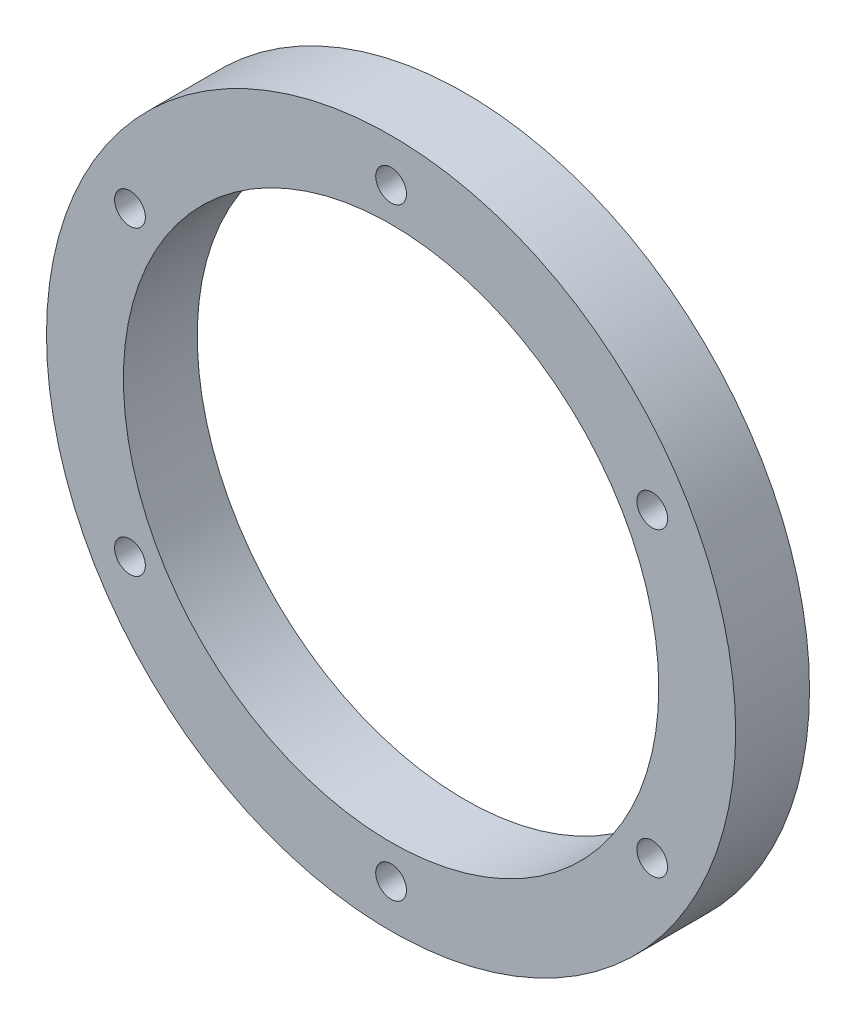
ISO-10303-21;
HEADER;
FILE_DESCRIPTION(('STEP AP214'),'2;1');
FILE_NAME('part.step','',(''),(''),'','','');
FILE_SCHEMA(('AUTOMOTIVE_DESIGN { 1 0 10303 214 1 1 1 1 }'));
ENDSEC;
DATA;
#1=APPLICATION_CONTEXT('core data for automotive mechanical design processes');
#2=APPLICATION_PROTOCOL_DEFINITION('international standard','automotive_design',2000,#1);
#3=PRODUCT_CONTEXT('',#1,'mechanical');
#4=PRODUCT('Part','Part','',(#3));
#5=PRODUCT_RELATED_PRODUCT_CATEGORY('part','',(#4));
#6=PRODUCT_DEFINITION_FORMATION('','',#4);
#7=PRODUCT_DEFINITION_CONTEXT('part definition',#1,'design');
#8=PRODUCT_DEFINITION('design','',#6,#7);
#9=PRODUCT_DEFINITION_SHAPE('','',#8);
#10=(LENGTH_UNIT() NAMED_UNIT(*) SI_UNIT(.MILLI.,.METRE.));
#11=(NAMED_UNIT(*) PLANE_ANGLE_UNIT() SI_UNIT($,.RADIAN.));
#12=(NAMED_UNIT(*) SI_UNIT($,.STERADIAN.) SOLID_ANGLE_UNIT());
#13=UNCERTAINTY_MEASURE_WITH_UNIT(LENGTH_MEASURE(1.E-05),#10,'distance_accuracy_value','');
#14=(GEOMETRIC_REPRESENTATION_CONTEXT(3) GLOBAL_UNCERTAINTY_ASSIGNED_CONTEXT((#13)) GLOBAL_UNIT_ASSIGNED_CONTEXT((#10,
#11,#12)) REPRESENTATION_CONTEXT('',''));
#15=CARTESIAN_POINT('',(0.,0.,0.));
#16=DIRECTION('',(0.,0.,1.));
#17=DIRECTION('',(1.,0.,0.));
#18=AXIS2_PLACEMENT_3D('',#15,#16,#17);
#19=CARTESIAN_POINT('',(0.,0.,6.));
#20=DIRECTION('',(0.,0.,1.));
#21=DIRECTION('',(1.,0.,0.));
#22=AXIS2_PLACEMENT_3D('',#19,#20,#21);
#23=PLANE('',#22);
#24=CARTESIAN_POINT('',(-21.2176223927187,-12.25,6.));
#25=DIRECTION('',(0.,0.,1.));
#26=DIRECTION('',(1.,0.,0.));
#27=AXIS2_PLACEMENT_3D('',#24,#25,#26);
#28=CIRCLE('',#27,1.25);
#29=CARTESIAN_POINT('',(-19.9676223927187,-12.25,6.));
#30=VERTEX_POINT('',#29);
#31=EDGE_CURVE('E73',#30,#30,#28,.T.);
#32=ORIENTED_EDGE('',*,*,#31,.F.);
#33=EDGE_LOOP('',(#32));
#34=FACE_BOUND('',#33,.T.);
#35=CARTESIAN_POINT('',(21.2176223927188,-12.25,6.));
#36=DIRECTION('',(0.,0.,1.));
#37=DIRECTION('',(1.,0.,0.));
#38=AXIS2_PLACEMENT_3D('',#35,#36,#37);
#39=CIRCLE('',#38,1.25);
#40=CARTESIAN_POINT('',(22.4676223927188,-12.25,6.));
#41=VERTEX_POINT('',#40);
#42=EDGE_CURVE('E61',#41,#41,#39,.T.);
#43=ORIENTED_EDGE('',*,*,#42,.F.);
#44=EDGE_LOOP('',(#43));
#45=FACE_BOUND('',#44,.T.);
#46=CARTESIAN_POINT('',(0.,0.,6.));
#47=DIRECTION('',(0.,0.,1.));
#48=DIRECTION('',(1.,0.,0.));
#49=AXIS2_PLACEMENT_3D('',#46,#47,#48);
#50=CIRCLE('',#49,21.75);
#51=CARTESIAN_POINT('',(21.75,0.,6.));
#52=VERTEX_POINT('',#51);
#53=EDGE_CURVE('E49',#52,#52,#50,.T.);
#54=ORIENTED_EDGE('',*,*,#53,.F.);
#55=EDGE_LOOP('',(#54));
#56=FACE_BOUND('',#55,.T.);
#57=CARTESIAN_POINT('',(0.,0.,6.));
#58=DIRECTION('',(0.,0.,1.));
#59=DIRECTION('',(1.,0.,0.));
#60=AXIS2_PLACEMENT_3D('',#57,#58,#59);
#61=CIRCLE('',#60,28.);
#62=CARTESIAN_POINT('',(28.,0.,6.));
#63=VERTEX_POINT('',#62);
#64=EDGE_CURVE('E10',#63,#63,#61,.T.);
#65=ORIENTED_EDGE('',*,*,#64,.T.);
#66=EDGE_LOOP('',(#65));
#67=FACE_BOUND('',#66,.T.);
#68=CARTESIAN_POINT('',(0.,24.5,6.));
#69=DIRECTION('',(0.,0.,1.));
#70=DIRECTION('',(1.,0.,0.));
#71=AXIS2_PLACEMENT_3D('',#68,#69,#70);
#72=CIRCLE('',#71,1.25);
#73=CARTESIAN_POINT('',(1.25,24.5,6.));
#74=VERTEX_POINT('',#73);
#75=EDGE_CURVE('E44',#74,#74,#72,.T.);
#76=ORIENTED_EDGE('',*,*,#75,.F.);
#77=EDGE_LOOP('',(#76));
#78=FACE_BOUND('',#77,.T.);
#79=CARTESIAN_POINT('',(21.2176223927187,12.25,6.));
#80=DIRECTION('',(0.,0.,1.));
#81=DIRECTION('',(1.,0.,0.));
#82=AXIS2_PLACEMENT_3D('',#79,#80,#81);
#83=CIRCLE('',#82,1.25);
#84=CARTESIAN_POINT('',(22.4676223927187,12.25,6.));
#85=VERTEX_POINT('',#84);
#86=EDGE_CURVE('E55',#85,#85,#83,.T.);
#87=ORIENTED_EDGE('',*,*,#86,.F.);
#88=EDGE_LOOP('',(#87));
#89=FACE_BOUND('',#88,.T.);
#90=CARTESIAN_POINT('',(0.,-24.5,6.));
#91=DIRECTION('',(0.,0.,1.));
#92=DIRECTION('',(1.,0.,0.));
#93=AXIS2_PLACEMENT_3D('',#90,#91,#92);
#94=CIRCLE('',#93,1.25);
#95=CARTESIAN_POINT('',(1.25,-24.5,6.));
#96=VERTEX_POINT('',#95);
#97=EDGE_CURVE('E67',#96,#96,#94,.T.);
#98=ORIENTED_EDGE('',*,*,#97,.F.);
#99=EDGE_LOOP('',(#98));
#100=FACE_BOUND('',#99,.T.);
#101=CARTESIAN_POINT('',(-21.2176223927188,12.25,6.));
#102=DIRECTION('',(0.,0.,1.));
#103=DIRECTION('',(1.,0.,0.));
#104=AXIS2_PLACEMENT_3D('',#101,#102,#103);
#105=CIRCLE('',#104,1.25);
#106=CARTESIAN_POINT('',(-19.9676223927188,12.25,6.));
#107=VERTEX_POINT('',#106);
#108=EDGE_CURVE('E79',#107,#107,#105,.T.);
#109=ORIENTED_EDGE('',*,*,#108,.F.);
#110=EDGE_LOOP('',(#109));
#111=FACE_BOUND('',#110,.T.);
#112=ADVANCED_FACE('F33',(#34,#45,#56,#67,#78,#89,#100,#111),#23,.T.);
#113=CARTESIAN_POINT('',(0.,0.,0.));
#114=DIRECTION('',(0.,0.,1.));
#115=DIRECTION('',(1.,0.,0.));
#116=AXIS2_PLACEMENT_3D('',#113,#114,#115);
#117=PLANE('',#116);
#118=CARTESIAN_POINT('',(0.,0.,0.));
#119=DIRECTION('',(0.,0.,1.));
#120=DIRECTION('',(1.,0.,0.));
#121=AXIS2_PLACEMENT_3D('',#118,#119,#120);
#122=CIRCLE('',#121,28.);
#123=CARTESIAN_POINT('',(28.,0.,0.));
#124=VERTEX_POINT('',#123);
#125=EDGE_CURVE('E37',#124,#124,#122,.T.);
#126=ORIENTED_EDGE('',*,*,#125,.F.);
#127=EDGE_LOOP('',(#126));
#128=FACE_BOUND('',#127,.T.);
#129=CARTESIAN_POINT('',(0.,24.5,0.));
#130=DIRECTION('',(0.,0.,1.));
#131=DIRECTION('',(1.,0.,0.));
#132=AXIS2_PLACEMENT_3D('',#129,#130,#131);
#133=CIRCLE('',#132,1.25);
#134=CARTESIAN_POINT('',(1.25,24.5,0.));
#135=VERTEX_POINT('',#134);
#136=EDGE_CURVE('E46',#135,#135,#133,.T.);
#137=ORIENTED_EDGE('',*,*,#136,.T.);
#138=EDGE_LOOP('',(#137));
#139=FACE_BOUND('',#138,.T.);
#140=CARTESIAN_POINT('',(0.,0.,0.));
#141=DIRECTION('',(0.,0.,1.));
#142=DIRECTION('',(1.,0.,0.));
#143=AXIS2_PLACEMENT_3D('',#140,#141,#142);
#144=CIRCLE('',#143,21.75);
#145=CARTESIAN_POINT('',(21.75,0.,0.));
#146=VERTEX_POINT('',#145);
#147=EDGE_CURVE('E52',#146,#146,#144,.T.);
#148=ORIENTED_EDGE('',*,*,#147,.T.);
#149=EDGE_LOOP('',(#148));
#150=FACE_BOUND('',#149,.T.);
#151=CARTESIAN_POINT('',(21.2176223927187,12.25,0.));
#152=DIRECTION('',(0.,0.,1.));
#153=DIRECTION('',(1.,0.,0.));
#154=AXIS2_PLACEMENT_3D('',#151,#152,#153);
#155=CIRCLE('',#154,1.25);
#156=CARTESIAN_POINT('',(22.4676223927187,12.25,0.));
#157=VERTEX_POINT('',#156);
#158=EDGE_CURVE('E58',#157,#157,#155,.T.);
#159=ORIENTED_EDGE('',*,*,#158,.T.);
#160=EDGE_LOOP('',(#159));
#161=FACE_BOUND('',#160,.T.);
#162=CARTESIAN_POINT('',(21.2176223927188,-12.25,0.));
#163=DIRECTION('',(0.,0.,1.));
#164=DIRECTION('',(1.,0.,0.));
#165=AXIS2_PLACEMENT_3D('',#162,#163,#164);
#166=CIRCLE('',#165,1.25);
#167=CARTESIAN_POINT('',(22.4676223927188,-12.25,0.));
#168=VERTEX_POINT('',#167);
#169=EDGE_CURVE('E64',#168,#168,#166,.T.);
#170=ORIENTED_EDGE('',*,*,#169,.T.);
#171=EDGE_LOOP('',(#170));
#172=FACE_BOUND('',#171,.T.);
#173=CARTESIAN_POINT('',(0.,-24.5,0.));
#174=DIRECTION('',(0.,0.,1.));
#175=DIRECTION('',(1.,0.,0.));
#176=AXIS2_PLACEMENT_3D('',#173,#174,#175);
#177=CIRCLE('',#176,1.25);
#178=CARTESIAN_POINT('',(1.25,-24.5,0.));
#179=VERTEX_POINT('',#178);
#180=EDGE_CURVE('E70',#179,#179,#177,.T.);
#181=ORIENTED_EDGE('',*,*,#180,.T.);
#182=EDGE_LOOP('',(#181));
#183=FACE_BOUND('',#182,.T.);
#184=CARTESIAN_POINT('',(-21.2176223927187,-12.25,0.));
#185=DIRECTION('',(0.,0.,1.));
#186=DIRECTION('',(1.,0.,0.));
#187=AXIS2_PLACEMENT_3D('',#184,#185,#186);
#188=CIRCLE('',#187,1.25);
#189=CARTESIAN_POINT('',(-19.9676223927187,-12.25,0.));
#190=VERTEX_POINT('',#189);
#191=EDGE_CURVE('E76',#190,#190,#188,.T.);
#192=ORIENTED_EDGE('',*,*,#191,.T.);
#193=EDGE_LOOP('',(#192));
#194=FACE_BOUND('',#193,.T.);
#195=CARTESIAN_POINT('',(-21.2176223927188,12.25,0.));
#196=DIRECTION('',(0.,0.,1.));
#197=DIRECTION('',(1.,0.,0.));
#198=AXIS2_PLACEMENT_3D('',#195,#196,#197);
#199=CIRCLE('',#198,1.25);
#200=CARTESIAN_POINT('',(-19.9676223927188,12.25,0.));
#201=VERTEX_POINT('',#200);
#202=EDGE_CURVE('E82',#201,#201,#199,.T.);
#203=ORIENTED_EDGE('',*,*,#202,.T.);
#204=EDGE_LOOP('',(#203));
#205=FACE_BOUND('',#204,.T.);
#206=ADVANCED_FACE('F92',(#128,#139,#150,#161,#172,#183,#194,#205),#117,.F.);
#207=CARTESIAN_POINT('',(0.,0.,6.));
#208=DIRECTION('',(0.,0.,-1.));
#209=DIRECTION('',(-1.,0.,0.));
#210=AXIS2_PLACEMENT_3D('',#207,#208,#209);
#211=CYLINDRICAL_SURFACE('',#210,28.);
#212=ORIENTED_EDGE('',*,*,#64,.F.);
#213=EDGE_LOOP('',(#212));
#214=FACE_BOUND('',#213,.T.);
#215=ORIENTED_EDGE('',*,*,#125,.T.);
#216=EDGE_LOOP('',(#215));
#217=FACE_BOUND('',#216,.T.);
#218=ADVANCED_FACE('F35',(#214,#217),#211,.T.);
#219=CARTESIAN_POINT('',(0.,24.5,6.));
#220=DIRECTION('',(0.,0.,-1.));
#221=DIRECTION('',(-1.,0.,0.));
#222=AXIS2_PLACEMENT_3D('',#219,#220,#221);
#223=CYLINDRICAL_SURFACE('',#222,1.25);
#224=ORIENTED_EDGE('',*,*,#75,.T.);
#225=EDGE_LOOP('',(#224));
#226=FACE_BOUND('',#225,.T.);
#227=ORIENTED_EDGE('',*,*,#136,.F.);
#228=EDGE_LOOP('',(#227));
#229=FACE_BOUND('',#228,.T.);
#230=ADVANCED_FACE('F102',(#226,#229),#223,.F.);
#231=CARTESIAN_POINT('',(0.,0.,6.));
#232=DIRECTION('',(0.,0.,-1.));
#233=DIRECTION('',(-1.,0.,0.));
#234=AXIS2_PLACEMENT_3D('',#231,#232,#233);
#235=CYLINDRICAL_SURFACE('',#234,21.75);
#236=ORIENTED_EDGE('',*,*,#53,.T.);
#237=EDGE_LOOP('',(#236));
#238=FACE_BOUND('',#237,.T.);
#239=ORIENTED_EDGE('',*,*,#147,.F.);
#240=EDGE_LOOP('',(#239));
#241=FACE_BOUND('',#240,.T.);
#242=ADVANCED_FACE('F105',(#238,#241),#235,.F.);
#243=CARTESIAN_POINT('',(21.2176223927187,12.25,6.));
#244=DIRECTION('',(0.,0.,-1.));
#245=DIRECTION('',(-1.,0.,0.));
#246=AXIS2_PLACEMENT_3D('',#243,#244,#245);
#247=CYLINDRICAL_SURFACE('',#246,1.25);
#248=ORIENTED_EDGE('',*,*,#86,.T.);
#249=EDGE_LOOP('',(#248));
#250=FACE_BOUND('',#249,.T.);
#251=ORIENTED_EDGE('',*,*,#158,.F.);
#252=EDGE_LOOP('',(#251));
#253=FACE_BOUND('',#252,.T.);
#254=ADVANCED_FACE('F109',(#250,#253),#247,.F.);
#255=CARTESIAN_POINT('',(21.2176223927188,-12.25,6.));
#256=DIRECTION('',(0.,0.,-1.));
#257=DIRECTION('',(-1.,0.,0.));
#258=AXIS2_PLACEMENT_3D('',#255,#256,#257);
#259=CYLINDRICAL_SURFACE('',#258,1.25);
#260=ORIENTED_EDGE('',*,*,#42,.T.);
#261=EDGE_LOOP('',(#260));
#262=FACE_BOUND('',#261,.T.);
#263=ORIENTED_EDGE('',*,*,#169,.F.);
#264=EDGE_LOOP('',(#263));
#265=FACE_BOUND('',#264,.T.);
#266=ADVANCED_FACE('F113',(#262,#265),#259,.F.);
#267=CARTESIAN_POINT('',(0.,-24.5,6.));
#268=DIRECTION('',(0.,0.,-1.));
#269=DIRECTION('',(-1.,0.,0.));
#270=AXIS2_PLACEMENT_3D('',#267,#268,#269);
#271=CYLINDRICAL_SURFACE('',#270,1.25);
#272=ORIENTED_EDGE('',*,*,#97,.T.);
#273=EDGE_LOOP('',(#272));
#274=FACE_BOUND('',#273,.T.);
#275=ORIENTED_EDGE('',*,*,#180,.F.);
#276=EDGE_LOOP('',(#275));
#277=FACE_BOUND('',#276,.T.);
#278=ADVANCED_FACE('F117',(#274,#277),#271,.F.);
#279=CARTESIAN_POINT('',(-21.2176223927187,-12.25,6.));
#280=DIRECTION('',(0.,0.,-1.));
#281=DIRECTION('',(-1.,0.,0.));
#282=AXIS2_PLACEMENT_3D('',#279,#280,#281);
#283=CYLINDRICAL_SURFACE('',#282,1.25);
#284=ORIENTED_EDGE('',*,*,#31,.T.);
#285=EDGE_LOOP('',(#284));
#286=FACE_BOUND('',#285,.T.);
#287=ORIENTED_EDGE('',*,*,#191,.F.);
#288=EDGE_LOOP('',(#287));
#289=FACE_BOUND('',#288,.T.);
#290=ADVANCED_FACE('F121',(#286,#289),#283,.F.);
#291=CARTESIAN_POINT('',(-21.2176223927188,12.25,6.));
#292=DIRECTION('',(0.,0.,-1.));
#293=DIRECTION('',(-1.,0.,0.));
#294=AXIS2_PLACEMENT_3D('',#291,#292,#293);
#295=CYLINDRICAL_SURFACE('',#294,1.25);
#296=ORIENTED_EDGE('',*,*,#108,.T.);
#297=EDGE_LOOP('',(#296));
#298=FACE_BOUND('',#297,.T.);
#299=ORIENTED_EDGE('',*,*,#202,.F.);
#300=EDGE_LOOP('',(#299));
#301=FACE_BOUND('',#300,.T.);
#302=ADVANCED_FACE('F88',(#298,#301),#295,.F.);
#303=CLOSED_SHELL('',(#112,#206,#218,#230,#242,#254,#266,#278,#290,#302));
#304=MANIFOLD_SOLID_BREP('B2',#303);
#305=ADVANCED_BREP_SHAPE_REPRESENTATION('',(#18,#304),#14);
#306=SHAPE_DEFINITION_REPRESENTATION(#9,#305);
ENDSEC;
END-ISO-10303-21;
